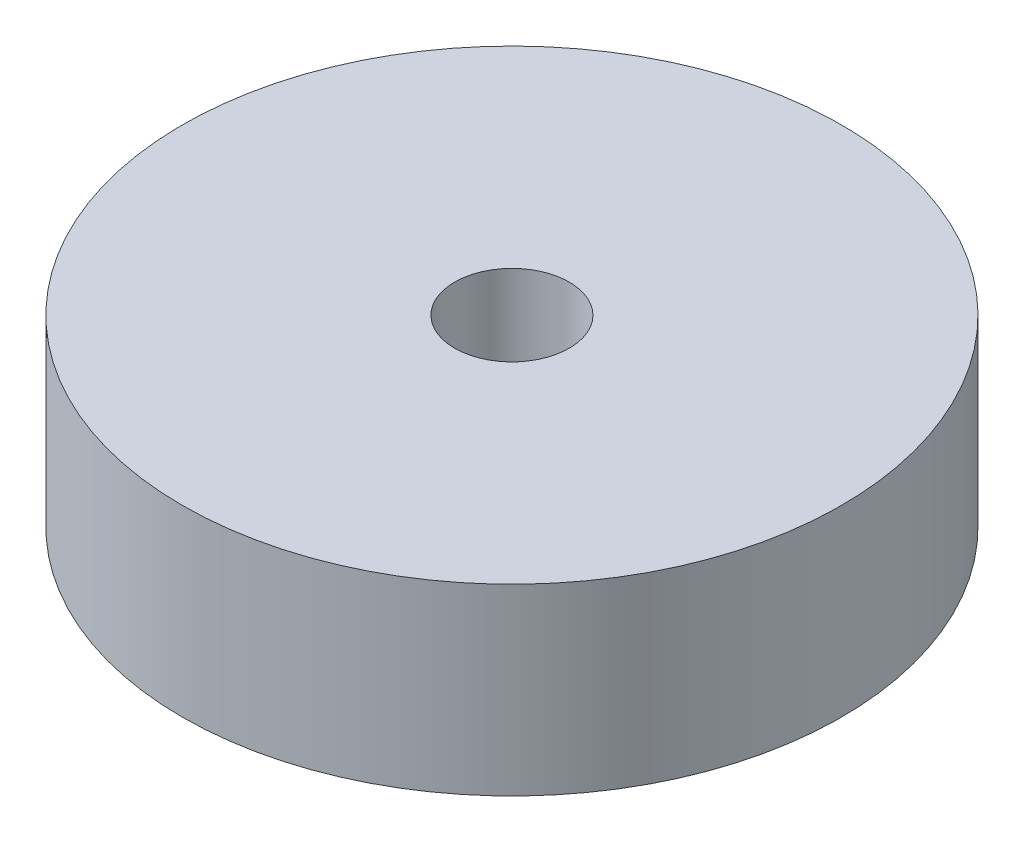
ISO-10303-21;
HEADER;
FILE_DESCRIPTION(('STEP AP214'),'2;1');
FILE_NAME('part.step','',(''),(''),'','','');
FILE_SCHEMA(('AUTOMOTIVE_DESIGN { 1 0 10303 214 1 1 1 1 }'));
ENDSEC;
DATA;
#1=APPLICATION_CONTEXT('core data for automotive mechanical design processes');
#2=APPLICATION_PROTOCOL_DEFINITION('international standard','automotive_design',2000,#1);
#3=PRODUCT_CONTEXT('',#1,'mechanical');
#4=PRODUCT('Part','Part','',(#3));
#5=PRODUCT_RELATED_PRODUCT_CATEGORY('part','',(#4));
#6=PRODUCT_DEFINITION_FORMATION('','',#4);
#7=PRODUCT_DEFINITION_CONTEXT('part definition',#1,'design');
#8=PRODUCT_DEFINITION('design','',#6,#7);
#9=PRODUCT_DEFINITION_SHAPE('','',#8);
#10=(LENGTH_UNIT() NAMED_UNIT(*) SI_UNIT(.MILLI.,.METRE.));
#11=(NAMED_UNIT(*) PLANE_ANGLE_UNIT() SI_UNIT($,.RADIAN.));
#12=(NAMED_UNIT(*) SI_UNIT($,.STERADIAN.) SOLID_ANGLE_UNIT());
#13=UNCERTAINTY_MEASURE_WITH_UNIT(LENGTH_MEASURE(1.E-05),#10,'distance_accuracy_value','');
#14=(GEOMETRIC_REPRESENTATION_CONTEXT(3) GLOBAL_UNCERTAINTY_ASSIGNED_CONTEXT((#13)) GLOBAL_UNIT_ASSIGNED_CONTEXT((#10,
#11,#12)) REPRESENTATION_CONTEXT('',''));
#15=CARTESIAN_POINT('',(0.,0.,0.));
#16=DIRECTION('',(0.,0.,1.));
#17=DIRECTION('',(1.,0.,0.));
#18=AXIS2_PLACEMENT_3D('',#15,#16,#17);
#19=CARTESIAN_POINT('',(0.,20.32,0.));
#20=DIRECTION('',(0.,1.,0.));
#21=DIRECTION('',(0.,0.,1.));
#22=AXIS2_PLACEMENT_3D('',#19,#20,#21);
#23=PLANE('',#22);
#24=CARTESIAN_POINT('',(0.,20.32,0.));
#25=DIRECTION('',(0.,1.,0.));
#26=DIRECTION('',(0.,0.,1.));
#27=AXIS2_PLACEMENT_3D('',#24,#25,#26);
#28=CIRCLE('',#27,36.5125);
#29=CARTESIAN_POINT('',(0.,20.32,36.5125));
#30=VERTEX_POINT('',#29);
#31=EDGE_CURVE('E10',#30,#30,#28,.T.);
#32=ORIENTED_EDGE('',*,*,#31,.T.);
#33=EDGE_LOOP('',(#32));
#34=FACE_BOUND('',#33,.T.);
#35=CARTESIAN_POINT('',(0.,20.32,0.));
#36=DIRECTION('',(0.,1.,0.));
#37=DIRECTION('',(0.,0.,1.));
#38=AXIS2_PLACEMENT_3D('',#35,#36,#37);
#39=CIRCLE('',#38,6.35);
#40=CARTESIAN_POINT('',(0.,20.32,6.35));
#41=VERTEX_POINT('',#40);
#42=EDGE_CURVE('E43',#41,#41,#39,.T.);
#43=ORIENTED_EDGE('',*,*,#42,.F.);
#44=EDGE_LOOP('',(#43));
#45=FACE_BOUND('',#44,.T.);
#46=ADVANCED_FACE('F32',(#34,#45),#23,.T.);
#47=CARTESIAN_POINT('',(0.,0.,0.));
#48=DIRECTION('',(0.,1.,0.));
#49=DIRECTION('',(0.,0.,1.));
#50=AXIS2_PLACEMENT_3D('',#47,#48,#49);
#51=PLANE('',#50);
#52=CARTESIAN_POINT('',(0.,0.,0.));
#53=DIRECTION('',(0.,1.,0.));
#54=DIRECTION('',(0.,0.,1.));
#55=AXIS2_PLACEMENT_3D('',#52,#53,#54);
#56=CIRCLE('',#55,36.5125);
#57=CARTESIAN_POINT('',(0.,0.,36.5125));
#58=VERTEX_POINT('',#57);
#59=EDGE_CURVE('E36',#58,#58,#56,.T.);
#60=ORIENTED_EDGE('',*,*,#59,.F.);
#61=EDGE_LOOP('',(#60));
#62=FACE_BOUND('',#61,.T.);
#63=CARTESIAN_POINT('',(0.,0.,0.));
#64=DIRECTION('',(0.,1.,0.));
#65=DIRECTION('',(0.,0.,1.));
#66=AXIS2_PLACEMENT_3D('',#63,#64,#65);
#67=CIRCLE('',#66,6.35);
#68=CARTESIAN_POINT('',(0.,0.,6.35));
#69=VERTEX_POINT('',#68);
#70=EDGE_CURVE('E45',#69,#69,#67,.T.);
#71=ORIENTED_EDGE('',*,*,#70,.T.);
#72=EDGE_LOOP('',(#71));
#73=FACE_BOUND('',#72,.T.);
#74=ADVANCED_FACE('F55',(#62,#73),#51,.F.);
#75=CARTESIAN_POINT('',(0.,20.32,0.));
#76=DIRECTION('',(0.,-1.,0.));
#77=DIRECTION('',(0.,0.,-1.));
#78=AXIS2_PLACEMENT_3D('',#75,#76,#77);
#79=CYLINDRICAL_SURFACE('',#78,36.5125);
#80=ORIENTED_EDGE('',*,*,#31,.F.);
#81=EDGE_LOOP('',(#80));
#82=FACE_BOUND('',#81,.T.);
#83=ORIENTED_EDGE('',*,*,#59,.T.);
#84=EDGE_LOOP('',(#83));
#85=FACE_BOUND('',#84,.T.);
#86=ADVANCED_FACE('F34',(#82,#85),#79,.T.);
#87=CARTESIAN_POINT('',(0.,20.32,0.));
#88=DIRECTION('',(0.,-1.,0.));
#89=DIRECTION('',(0.,0.,-1.));
#90=AXIS2_PLACEMENT_3D('',#87,#88,#89);
#91=CYLINDRICAL_SURFACE('',#90,6.35);
#92=ORIENTED_EDGE('',*,*,#42,.T.);
#93=EDGE_LOOP('',(#92));
#94=FACE_BOUND('',#93,.T.);
#95=ORIENTED_EDGE('',*,*,#70,.F.);
#96=EDGE_LOOP('',(#95));
#97=FACE_BOUND('',#96,.T.);
#98=ADVANCED_FACE('F51',(#94,#97),#91,.F.);
#99=CLOSED_SHELL('',(#46,#74,#86,#98));
#100=MANIFOLD_SOLID_BREP('B2',#99);
#101=ADVANCED_BREP_SHAPE_REPRESENTATION('',(#18,#100),#14);
#102=SHAPE_DEFINITION_REPRESENTATION(#9,#101);
ENDSEC;
END-ISO-10303-21;
